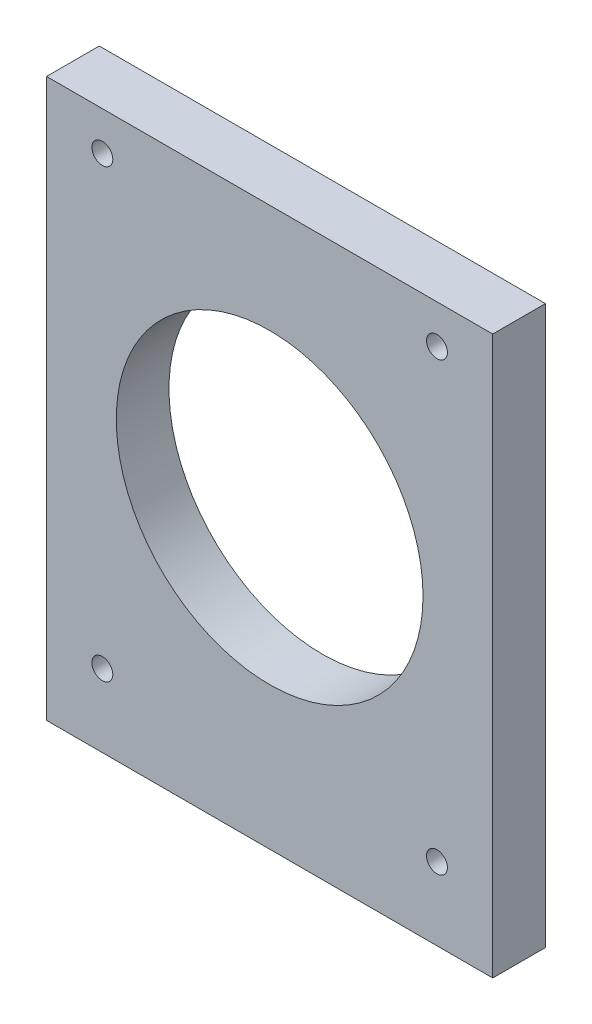
ISO-10303-21;
HEADER;
FILE_DESCRIPTION(('STEP AP214'),'2;1');
FILE_NAME('part.step','',(''),(''),'','','');
FILE_SCHEMA(('AUTOMOTIVE_DESIGN { 1 0 10303 214 1 1 1 1 }'));
ENDSEC;
DATA;
#1=APPLICATION_CONTEXT('core data for automotive mechanical design processes');
#2=APPLICATION_PROTOCOL_DEFINITION('international standard','automotive_design',2000,#1);
#3=PRODUCT_CONTEXT('',#1,'mechanical');
#4=PRODUCT('Part','Part','',(#3));
#5=PRODUCT_RELATED_PRODUCT_CATEGORY('part','',(#4));
#6=PRODUCT_DEFINITION_FORMATION('','',#4);
#7=PRODUCT_DEFINITION_CONTEXT('part definition',#1,'design');
#8=PRODUCT_DEFINITION('design','',#6,#7);
#9=PRODUCT_DEFINITION_SHAPE('','',#8);
#10=(LENGTH_UNIT() NAMED_UNIT(*) SI_UNIT(.MILLI.,.METRE.));
#11=(NAMED_UNIT(*) PLANE_ANGLE_UNIT() SI_UNIT($,.RADIAN.));
#12=(NAMED_UNIT(*) SI_UNIT($,.STERADIAN.) SOLID_ANGLE_UNIT());
#13=UNCERTAINTY_MEASURE_WITH_UNIT(LENGTH_MEASURE(1.E-05),#10,'distance_accuracy_value','');
#14=(GEOMETRIC_REPRESENTATION_CONTEXT(3) GLOBAL_UNCERTAINTY_ASSIGNED_CONTEXT((#13)) GLOBAL_UNIT_ASSIGNED_CONTEXT((#10,
#11,#12)) REPRESENTATION_CONTEXT('',''));
#15=CARTESIAN_POINT('',(0.,0.,0.));
#16=DIRECTION('',(0.,0.,1.));
#17=DIRECTION('',(1.,0.,0.));
#18=AXIS2_PLACEMENT_3D('',#15,#16,#17);
#19=CARTESIAN_POINT('',(0.,0.,12.0000014));
#20=DIRECTION('',(0.,0.,1.));
#21=DIRECTION('',(1.,0.,0.));
#22=AXIS2_PLACEMENT_3D('',#19,#20,#21);
#23=PLANE('',#22);
#24=CARTESIAN_POINT('',(-43.9659550031606,19.4970796823574,12.0000014));
#25=DIRECTION('',(0.,0.,1.));
#26=DIRECTION('',(1.,0.,0.));
#27=AXIS2_PLACEMENT_3D('',#24,#25,#26);
#28=CIRCLE('',#27,2.38125);
#29=CARTESIAN_POINT('',(-41.5847050031606,19.4970796823574,12.0000014));
#30=VERTEX_POINT('',#29);
#31=EDGE_CURVE('E127',#30,#30,#28,.T.);
#32=ORIENTED_EDGE('',*,*,#31,.F.);
#33=EDGE_LOOP('',(#32));
#34=FACE_BOUND('',#33,.T.);
#35=CARTESIAN_POINT('',(-43.9659550031606,121.097079682357,12.0000014));
#36=DIRECTION('',(0.,0.,1.));
#37=DIRECTION('',(1.,0.,0.));
#38=AXIS2_PLACEMENT_3D('',#35,#36,#37);
#39=CIRCLE('',#38,2.38125);
#40=CARTESIAN_POINT('',(-41.5847050031606,121.097079682357,12.0000014));
#41=VERTEX_POINT('',#40);
#42=EDGE_CURVE('E115',#41,#41,#39,.T.);
#43=ORIENTED_EDGE('',*,*,#42,.F.);
#44=EDGE_LOOP('',(#43));
#45=FACE_BOUND('',#44,.T.);
#46=DIRECTION('',(0.,-1.,0.));
#47=VECTOR('',#46,1.);
#48=CARTESIAN_POINT('',(-56.6659550031605,129.922081082357,12.0000014));
#49=LINE('',#48,#47);
#50=CARTESIAN_POINT('',(-56.6659550031605,129.922081082357,12.0000014));
#51=VERTEX_POINT('',#50);
#52=CARTESIAN_POINT('',(-56.6659550031605,2.92208108235741,12.0000014));
#53=VERTEX_POINT('',#52);
#54=EDGE_CURVE('E85',#51,#53,#49,.T.);
#55=ORIENTED_EDGE('',*,*,#54,.T.);
#56=DIRECTION('',(1.,0.,0.));
#57=VECTOR('',#56,1.);
#58=CARTESIAN_POINT('',(-56.6659550031605,2.92208108235741,12.0000014));
#59=LINE('',#58,#57);
#60=CARTESIAN_POINT('',(44.9340449968395,2.92208108235742,12.0000014));
#61=VERTEX_POINT('',#60);
#62=EDGE_CURVE('E80',#53,#61,#59,.T.);
#63=ORIENTED_EDGE('',*,*,#62,.T.);
#64=DIRECTION('',(0.,1.,0.));
#65=VECTOR('',#64,1.);
#66=CARTESIAN_POINT('',(44.9340449968395,129.922081082357,12.0000014));
#67=LINE('',#66,#65);
#68=CARTESIAN_POINT('',(44.9340449968395,129.922081082357,12.0000014));
#69=VERTEX_POINT('',#68);
#70=EDGE_CURVE('E83',#61,#69,#67,.T.);
#71=ORIENTED_EDGE('',*,*,#70,.T.);
#72=DIRECTION('',(-1.,0.,0.));
#73=VECTOR('',#72,1.);
#74=CARTESIAN_POINT('',(-56.6659550031605,129.922081082357,12.0000014));
#75=LINE('',#74,#73);
#76=EDGE_CURVE('E50',#69,#51,#75,.T.);
#77=ORIENTED_EDGE('',*,*,#76,.T.);
#78=EDGE_LOOP('',(#55,#63,#71,#77));
#79=FACE_BOUND('',#78,.T.);
#80=CARTESIAN_POINT('',(-5.86595500316057,70.2970796823574,12.0000014));
#81=DIRECTION('',(0.,0.,1.));
#82=DIRECTION('',(1.,0.,0.));
#83=AXIS2_PLACEMENT_3D('',#80,#81,#82);
#84=CIRCLE('',#83,34.925);
#85=CARTESIAN_POINT('',(29.0590449968394,70.2970796823574,12.0000014));
#86=VERTEX_POINT('',#85);
#87=EDGE_CURVE('E100',#86,#86,#84,.T.);
#88=ORIENTED_EDGE('',*,*,#87,.F.);
#89=EDGE_LOOP('',(#88));
#90=FACE_BOUND('',#89,.T.);
#91=CARTESIAN_POINT('',(32.2340449968394,121.097079682357,12.0000014));
#92=DIRECTION('',(0.,0.,1.));
#93=DIRECTION('',(1.,0.,0.));
#94=AXIS2_PLACEMENT_3D('',#91,#92,#93);
#95=CIRCLE('',#94,2.38125);
#96=CARTESIAN_POINT('',(34.6152949968394,121.097079682357,12.0000014));
#97=VERTEX_POINT('',#96);
#98=EDGE_CURVE('E121',#97,#97,#95,.T.);
#99=ORIENTED_EDGE('',*,*,#98,.F.);
#100=EDGE_LOOP('',(#99));
#101=FACE_BOUND('',#100,.T.);
#102=CARTESIAN_POINT('',(32.2340449968394,19.4970796823574,12.0000014));
#103=DIRECTION('',(0.,0.,1.));
#104=DIRECTION('',(1.,0.,0.));
#105=AXIS2_PLACEMENT_3D('',#102,#103,#104);
#106=CIRCLE('',#105,2.38125);
#107=CARTESIAN_POINT('',(34.6152949968394,19.4970796823574,12.0000014));
#108=VERTEX_POINT('',#107);
#109=EDGE_CURVE('E133',#108,#108,#106,.T.);
#110=ORIENTED_EDGE('',*,*,#109,.F.);
#111=EDGE_LOOP('',(#110));
#112=FACE_BOUND('',#111,.T.);
#113=ADVANCED_FACE('F33',(#34,#45,#79,#90,#101,#112),#23,.T.);
#114=CARTESIAN_POINT('',(0.,0.,0.));
#115=DIRECTION('',(0.,0.,1.));
#116=DIRECTION('',(1.,0.,0.));
#117=AXIS2_PLACEMENT_3D('',#114,#115,#116);
#118=PLANE('',#117);
#119=DIRECTION('',(0.,-1.,0.));
#120=VECTOR('',#119,1.);
#121=CARTESIAN_POINT('',(-56.6659550031605,129.922081082357,0.));
#122=LINE('',#121,#120);
#123=CARTESIAN_POINT('',(-56.6659550031605,129.922081082357,0.));
#124=VERTEX_POINT('',#123);
#125=CARTESIAN_POINT('',(-56.6659550031605,2.92208108235741,0.));
#126=VERTEX_POINT('',#125);
#127=EDGE_CURVE('E97',#124,#126,#122,.T.);
#128=ORIENTED_EDGE('',*,*,#127,.F.);
#129=DIRECTION('',(-1.,0.,0.));
#130=VECTOR('',#129,1.);
#131=CARTESIAN_POINT('',(-56.6659550031605,129.922081082357,0.));
#132=LINE('',#131,#130);
#133=CARTESIAN_POINT('',(44.9340449968395,129.922081082357,0.));
#134=VERTEX_POINT('',#133);
#135=EDGE_CURVE('E73',#134,#124,#132,.T.);
#136=ORIENTED_EDGE('',*,*,#135,.F.);
#137=DIRECTION('',(0.,1.,0.));
#138=VECTOR('',#137,1.);
#139=CARTESIAN_POINT('',(44.9340449968395,129.922081082357,0.));
#140=LINE('',#139,#138);
#141=CARTESIAN_POINT('',(44.9340449968395,2.92208108235742,0.));
#142=VERTEX_POINT('',#141);
#143=EDGE_CURVE('E67',#142,#134,#140,.T.);
#144=ORIENTED_EDGE('',*,*,#143,.F.);
#145=DIRECTION('',(1.,0.,0.));
#146=VECTOR('',#145,1.);
#147=CARTESIAN_POINT('',(-56.6659550031605,2.92208108235741,0.));
#148=LINE('',#147,#146);
#149=EDGE_CURVE('E89',#126,#142,#148,.T.);
#150=ORIENTED_EDGE('',*,*,#149,.F.);
#151=EDGE_LOOP('',(#128,#136,#144,#150));
#152=FACE_BOUND('',#151,.T.);
#153=CARTESIAN_POINT('',(-5.86595500316057,70.2970796823574,0.));
#154=DIRECTION('',(0.,0.,1.));
#155=DIRECTION('',(1.,0.,0.));
#156=AXIS2_PLACEMENT_3D('',#153,#154,#155);
#157=CIRCLE('',#156,34.925);
#158=CARTESIAN_POINT('',(29.0590449968394,70.2970796823574,0.));
#159=VERTEX_POINT('',#158);
#160=EDGE_CURVE('E112',#159,#159,#157,.T.);
#161=ORIENTED_EDGE('',*,*,#160,.T.);
#162=EDGE_LOOP('',(#161));
#163=FACE_BOUND('',#162,.T.);
#164=CARTESIAN_POINT('',(-43.9659550031606,121.097079682357,0.));
#165=DIRECTION('',(0.,0.,1.));
#166=DIRECTION('',(1.,0.,0.));
#167=AXIS2_PLACEMENT_3D('',#164,#165,#166);
#168=CIRCLE('',#167,2.38125);
#169=CARTESIAN_POINT('',(-41.5847050031606,121.097079682357,0.));
#170=VERTEX_POINT('',#169);
#171=EDGE_CURVE('E118',#170,#170,#168,.T.);
#172=ORIENTED_EDGE('',*,*,#171,.T.);
#173=EDGE_LOOP('',(#172));
#174=FACE_BOUND('',#173,.T.);
#175=CARTESIAN_POINT('',(32.2340449968394,121.097079682357,0.));
#176=DIRECTION('',(0.,0.,1.));
#177=DIRECTION('',(1.,0.,0.));
#178=AXIS2_PLACEMENT_3D('',#175,#176,#177);
#179=CIRCLE('',#178,2.38125);
#180=CARTESIAN_POINT('',(34.6152949968394,121.097079682357,0.));
#181=VERTEX_POINT('',#180);
#182=EDGE_CURVE('E124',#181,#181,#179,.T.);
#183=ORIENTED_EDGE('',*,*,#182,.T.);
#184=EDGE_LOOP('',(#183));
#185=FACE_BOUND('',#184,.T.);
#186=CARTESIAN_POINT('',(-43.9659550031606,19.4970796823574,0.));
#187=DIRECTION('',(0.,0.,1.));
#188=DIRECTION('',(1.,0.,0.));
#189=AXIS2_PLACEMENT_3D('',#186,#187,#188);
#190=CIRCLE('',#189,2.38125);
#191=CARTESIAN_POINT('',(-41.5847050031606,19.4970796823574,0.));
#192=VERTEX_POINT('',#191);
#193=EDGE_CURVE('E130',#192,#192,#190,.T.);
#194=ORIENTED_EDGE('',*,*,#193,.T.);
#195=EDGE_LOOP('',(#194));
#196=FACE_BOUND('',#195,.T.);
#197=CARTESIAN_POINT('',(32.2340449968394,19.4970796823574,0.));
#198=DIRECTION('',(0.,0.,1.));
#199=DIRECTION('',(1.,0.,0.));
#200=AXIS2_PLACEMENT_3D('',#197,#198,#199);
#201=CIRCLE('',#200,2.38125);
#202=CARTESIAN_POINT('',(34.6152949968394,19.4970796823574,0.));
#203=VERTEX_POINT('',#202);
#204=EDGE_CURVE('E136',#203,#203,#201,.T.);
#205=ORIENTED_EDGE('',*,*,#204,.T.);
#206=EDGE_LOOP('',(#205));
#207=FACE_BOUND('',#206,.T.);
#208=ADVANCED_FACE('F108',(#152,#163,#174,#185,#196,#207),#118,.F.);
#209=CARTESIAN_POINT('',(-56.6659550031605,129.922081082357,12.0000014));
#210=DIRECTION('',(1.,0.,0.));
#211=DIRECTION('',(0.,1.,0.));
#212=AXIS2_PLACEMENT_3D('',#209,#210,#211);
#213=PLANE('',#212);
#214=ORIENTED_EDGE('',*,*,#127,.T.);
#215=DIRECTION('',(0.,0.,-1.));
#216=VECTOR('',#215,1.);
#217=CARTESIAN_POINT('',(-56.6659550031605,2.92208108235741,12.0000014));
#218=LINE('',#217,#216);
#219=EDGE_CURVE('E11',#53,#126,#218,.T.);
#220=ORIENTED_EDGE('',*,*,#219,.F.);
#221=ORIENTED_EDGE('',*,*,#54,.F.);
#222=DIRECTION('',(0.,0.,-1.));
#223=VECTOR('',#222,1.);
#224=CARTESIAN_POINT('',(-56.6659550031605,129.922081082357,12.0000014));
#225=LINE('',#224,#223);
#226=EDGE_CURVE('E93',#51,#124,#225,.T.);
#227=ORIENTED_EDGE('',*,*,#226,.T.);
#228=EDGE_LOOP('',(#214,#220,#221,#227));
#229=FACE_BOUND('',#228,.T.);
#230=ADVANCED_FACE('F35',(#229),#213,.F.);
#231=CARTESIAN_POINT('',(-56.6659550031605,2.92208108235741,12.0000014));
#232=DIRECTION('',(0.,1.,0.));
#233=DIRECTION('',(-1.,0.,0.));
#234=AXIS2_PLACEMENT_3D('',#231,#232,#233);
#235=PLANE('',#234);
#236=ORIENTED_EDGE('',*,*,#149,.T.);
#237=DIRECTION('',(0.,0.,-1.));
#238=VECTOR('',#237,1.);
#239=CARTESIAN_POINT('',(44.9340449968395,2.92208108235742,12.0000014));
#240=LINE('',#239,#238);
#241=EDGE_CURVE('E42',#61,#142,#240,.T.);
#242=ORIENTED_EDGE('',*,*,#241,.F.);
#243=ORIENTED_EDGE('',*,*,#62,.F.);
#244=ORIENTED_EDGE('',*,*,#219,.T.);
#245=EDGE_LOOP('',(#236,#242,#243,#244));
#246=FACE_BOUND('',#245,.T.);
#247=ADVANCED_FACE('F88',(#246),#235,.F.);
#248=CARTESIAN_POINT('',(44.9340449968395,129.922081082357,12.0000014));
#249=DIRECTION('',(-1.,0.,0.));
#250=DIRECTION('',(0.,-1.,0.));
#251=AXIS2_PLACEMENT_3D('',#248,#249,#250);
#252=PLANE('',#251);
#253=ORIENTED_EDGE('',*,*,#143,.T.);
#254=DIRECTION('',(0.,0.,-1.));
#255=VECTOR('',#254,1.);
#256=CARTESIAN_POINT('',(44.9340449968395,129.922081082357,12.0000014));
#257=LINE('',#256,#255);
#258=EDGE_CURVE('E90',#69,#134,#257,.T.);
#259=ORIENTED_EDGE('',*,*,#258,.F.);
#260=ORIENTED_EDGE('',*,*,#70,.F.);
#261=ORIENTED_EDGE('',*,*,#241,.T.);
#262=EDGE_LOOP('',(#253,#259,#260,#261));
#263=FACE_BOUND('',#262,.T.);
#264=ADVANCED_FACE('F91',(#263),#252,.F.);
#265=CARTESIAN_POINT('',(-56.6659550031605,129.922081082357,12.0000014));
#266=DIRECTION('',(0.,-1.,0.));
#267=DIRECTION('',(1.,0.,0.));
#268=AXIS2_PLACEMENT_3D('',#265,#266,#267);
#269=PLANE('',#268);
#270=ORIENTED_EDGE('',*,*,#135,.T.);
#271=ORIENTED_EDGE('',*,*,#226,.F.);
#272=ORIENTED_EDGE('',*,*,#76,.F.);
#273=ORIENTED_EDGE('',*,*,#258,.T.);
#274=EDGE_LOOP('',(#270,#271,#272,#273));
#275=FACE_BOUND('',#274,.T.);
#276=ADVANCED_FACE('F105',(#275),#269,.F.);
#277=CARTESIAN_POINT('',(-5.86595500316057,70.2970796823574,12.0000014));
#278=DIRECTION('',(0.,0.,-1.));
#279=DIRECTION('',(-1.,0.,0.));
#280=AXIS2_PLACEMENT_3D('',#277,#278,#279);
#281=CYLINDRICAL_SURFACE('',#280,34.925);
#282=ORIENTED_EDGE('',*,*,#87,.T.);
#283=EDGE_LOOP('',(#282));
#284=FACE_BOUND('',#283,.T.);
#285=ORIENTED_EDGE('',*,*,#160,.F.);
#286=EDGE_LOOP('',(#285));
#287=FACE_BOUND('',#286,.T.);
#288=ADVANCED_FACE('F155',(#284,#287),#281,.F.);
#289=CARTESIAN_POINT('',(-43.9659550031606,121.097079682357,12.0000014));
#290=DIRECTION('',(0.,0.,-1.));
#291=DIRECTION('',(-1.,0.,0.));
#292=AXIS2_PLACEMENT_3D('',#289,#290,#291);
#293=CYLINDRICAL_SURFACE('',#292,2.38125);
#294=ORIENTED_EDGE('',*,*,#42,.T.);
#295=EDGE_LOOP('',(#294));
#296=FACE_BOUND('',#295,.T.);
#297=ORIENTED_EDGE('',*,*,#171,.F.);
#298=EDGE_LOOP('',(#297));
#299=FACE_BOUND('',#298,.T.);
#300=ADVANCED_FACE('F201',(#296,#299),#293,.F.);
#301=CARTESIAN_POINT('',(32.2340449968394,121.097079682357,12.0000014));
#302=DIRECTION('',(0.,0.,-1.));
#303=DIRECTION('',(-1.,0.,0.));
#304=AXIS2_PLACEMENT_3D('',#301,#302,#303);
#305=CYLINDRICAL_SURFACE('',#304,2.38125);
#306=ORIENTED_EDGE('',*,*,#98,.T.);
#307=EDGE_LOOP('',(#306));
#308=FACE_BOUND('',#307,.T.);
#309=ORIENTED_EDGE('',*,*,#182,.F.);
#310=EDGE_LOOP('',(#309));
#311=FACE_BOUND('',#310,.T.);
#312=ADVANCED_FACE('F209',(#308,#311),#305,.F.);
#313=CARTESIAN_POINT('',(-43.9659550031606,19.4970796823574,12.0000014));
#314=DIRECTION('',(0.,0.,-1.));
#315=DIRECTION('',(-1.,0.,0.));
#316=AXIS2_PLACEMENT_3D('',#313,#314,#315);
#317=CYLINDRICAL_SURFACE('',#316,2.38125);
#318=ORIENTED_EDGE('',*,*,#31,.T.);
#319=EDGE_LOOP('',(#318));
#320=FACE_BOUND('',#319,.T.);
#321=ORIENTED_EDGE('',*,*,#193,.F.);
#322=EDGE_LOOP('',(#321));
#323=FACE_BOUND('',#322,.T.);
#324=ADVANCED_FACE('F217',(#320,#323),#317,.F.);
#325=CARTESIAN_POINT('',(32.2340449968394,19.4970796823574,12.0000014));
#326=DIRECTION('',(0.,0.,-1.));
#327=DIRECTION('',(-1.,0.,0.));
#328=AXIS2_PLACEMENT_3D('',#325,#326,#327);
#329=CYLINDRICAL_SURFACE('',#328,2.38125);
#330=ORIENTED_EDGE('',*,*,#109,.T.);
#331=EDGE_LOOP('',(#330));
#332=FACE_BOUND('',#331,.T.);
#333=ORIENTED_EDGE('',*,*,#204,.F.);
#334=EDGE_LOOP('',(#333));
#335=FACE_BOUND('',#334,.T.);
#336=ADVANCED_FACE('F142',(#332,#335),#329,.F.);
#337=CLOSED_SHELL('',(#113,#208,#230,#247,#264,#276,#288,#300,#312,#324,#336));
#338=MANIFOLD_SOLID_BREP('B2',#337);
#339=ADVANCED_BREP_SHAPE_REPRESENTATION('',(#18,#338),#14);
#340=SHAPE_DEFINITION_REPRESENTATION(#9,#339);
ENDSEC;
END-ISO-10303-21;
